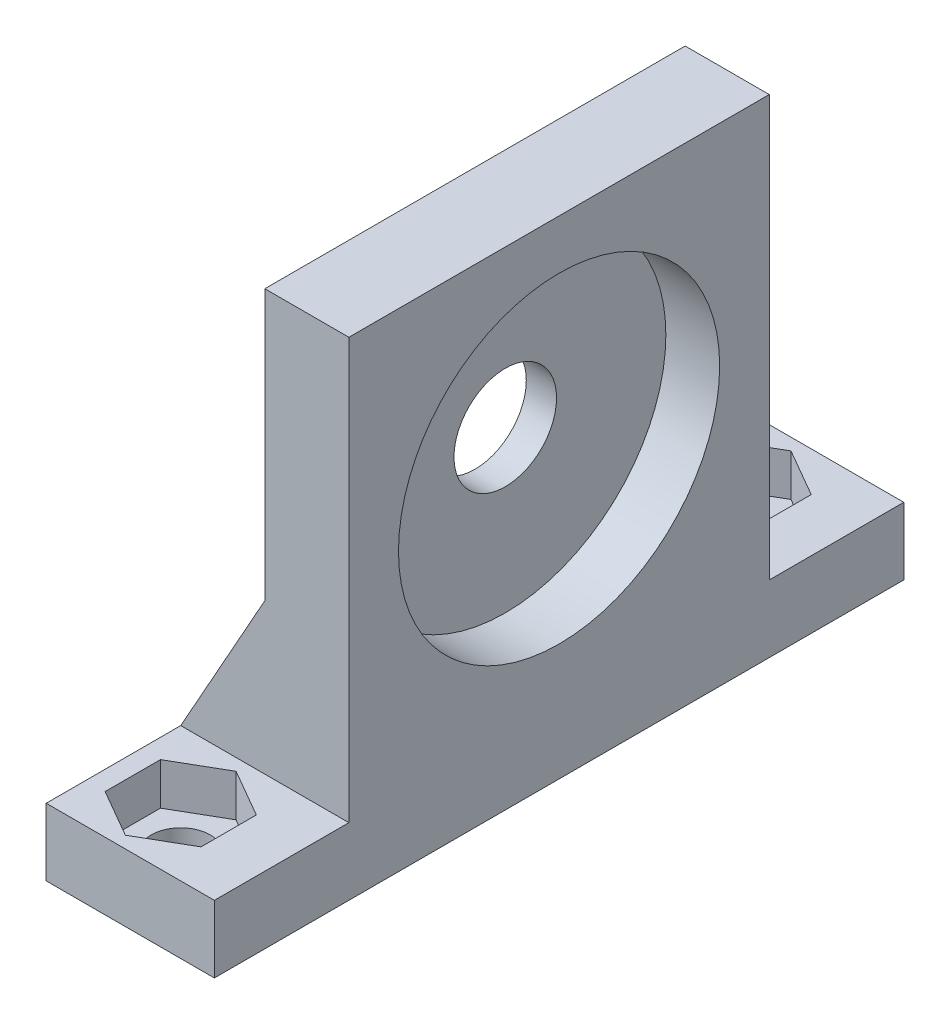
ISO-10303-21;
HEADER;
FILE_DESCRIPTION(('STEP AP214'),'2;1');
FILE_NAME('part.step','',(''),(''),'','','');
FILE_SCHEMA(('AUTOMOTIVE_DESIGN { 1 0 10303 214 1 1 1 1 }'));
ENDSEC;
DATA;
#1=APPLICATION_CONTEXT('core data for automotive mechanical design processes');
#2=APPLICATION_PROTOCOL_DEFINITION('international standard','automotive_design',2000,#1);
#3=PRODUCT_CONTEXT('',#1,'mechanical');
#4=PRODUCT('Part','Part','',(#3));
#5=PRODUCT_RELATED_PRODUCT_CATEGORY('part','',(#4));
#6=PRODUCT_DEFINITION_FORMATION('','',#4);
#7=PRODUCT_DEFINITION_CONTEXT('part definition',#1,'design');
#8=PRODUCT_DEFINITION('design','',#6,#7);
#9=PRODUCT_DEFINITION_SHAPE('','',#8);
#10=(LENGTH_UNIT() NAMED_UNIT(*) SI_UNIT(.MILLI.,.METRE.));
#11=(NAMED_UNIT(*) PLANE_ANGLE_UNIT() SI_UNIT($,.RADIAN.));
#12=(NAMED_UNIT(*) SI_UNIT($,.STERADIAN.) SOLID_ANGLE_UNIT());
#13=UNCERTAINTY_MEASURE_WITH_UNIT(LENGTH_MEASURE(1.E-05),#10,'distance_accuracy_value','');
#14=(GEOMETRIC_REPRESENTATION_CONTEXT(3) GLOBAL_UNCERTAINTY_ASSIGNED_CONTEXT((#13)) GLOBAL_UNIT_ASSIGNED_CONTEXT((#10,
#11,#12)) REPRESENTATION_CONTEXT('',''));
#15=CARTESIAN_POINT('',(0.,0.,0.));
#16=DIRECTION('',(0.,0.,1.));
#17=DIRECTION('',(1.,0.,0.));
#18=AXIS2_PLACEMENT_3D('',#15,#16,#17);
#19=CARTESIAN_POINT('',(5.,16.5,-12.5));
#20=DIRECTION('',(1.,0.,0.));
#21=DIRECTION('',(0.,0.,-1.));
#22=AXIS2_PLACEMENT_3D('',#19,#20,#21);
#23=CYLINDRICAL_SURFACE('',#22,3.05);
#24=CARTESIAN_POINT('',(5.,16.5,-12.5));
#25=DIRECTION('',(-1.,0.,0.));
#26=DIRECTION('',(0.,0.,1.));
#27=AXIS2_PLACEMENT_3D('',#24,#25,#26);
#28=CIRCLE('',#27,3.05);
#29=CARTESIAN_POINT('',(5.,16.5,-9.45));
#30=VERTEX_POINT('',#29);
#31=EDGE_CURVE('E514',#30,#30,#28,.T.);
#32=ORIENTED_EDGE('',*,*,#31,.T.);
#33=EDGE_LOOP('',(#32));
#34=FACE_BOUND('',#33,.T.);
#35=CARTESIAN_POINT('',(6.8,16.5,-12.5));
#36=DIRECTION('',(1.,0.,0.));
#37=DIRECTION('',(0.,0.,-1.));
#38=AXIS2_PLACEMENT_3D('',#35,#36,#37);
#39=CIRCLE('',#38,3.05);
#40=CARTESIAN_POINT('',(6.8,16.5,-15.55));
#41=VERTEX_POINT('',#40);
#42=EDGE_CURVE('E200',#41,#41,#39,.T.);
#43=ORIENTED_EDGE('',*,*,#42,.T.);
#44=EDGE_LOOP('',(#43));
#45=FACE_BOUND('',#44,.T.);
#46=ADVANCED_FACE('F196',(#34,#45),#23,.F.);
#47=CARTESIAN_POINT('',(0.,4.,0.));
#48=DIRECTION('',(0.,1.,0.));
#49=DIRECTION('',(0.,0.,1.));
#50=AXIS2_PLACEMENT_3D('',#47,#48,#49);
#51=PLANE('',#50);
#52=DIRECTION('',(0.866025403784439,0.,-0.5));
#53=VECTOR('',#52,1.);
#54=CARTESIAN_POINT('',(-12.9823683548744,4.,-22.4861215932168));
#55=LINE('',#54,#53);
#56=CARTESIAN_POINT('',(1.15000000000001,4.,-30.6454482671904));
#57=VERTEX_POINT('',#56);
#58=CARTESIAN_POINT('',(4.00000000000001,4.,-32.2908965343809));
#59=VERTEX_POINT('',#58);
#60=EDGE_CURVE('E549',#57,#59,#55,.T.);
#61=ORIENTED_EDGE('',*,*,#60,.T.);
#62=DIRECTION('',(0.866025403784438,0.,0.500000000000001));
#63=VECTOR('',#62,1.);
#64=CARTESIAN_POINT('',(14.9823683548744,4.,-25.9502232083545));
#65=LINE('',#64,#63);
#66=CARTESIAN_POINT('',(6.85,4.,-30.6454482671904));
#67=VERTEX_POINT('',#66);
#68=EDGE_CURVE('E543',#59,#67,#65,.T.);
#69=ORIENTED_EDGE('',*,*,#68,.T.);
#70=DIRECTION('',(0.,0.,1.));
#71=VECTOR('',#70,1.);
#72=CARTESIAN_POINT('',(6.84999999999999,4.,0.));
#73=LINE('',#72,#71);
#74=CARTESIAN_POINT('',(6.85,4.,-27.3545517328096));
#75=VERTEX_POINT('',#74);
#76=EDGE_CURVE('E568',#67,#75,#73,.T.);
#77=ORIENTED_EDGE('',*,*,#76,.T.);
#78=DIRECTION('',(-0.866025403784439,0.,0.5));
#79=VECTOR('',#78,1.);
#80=CARTESIAN_POINT('',(-10.1323683548744,4.,-17.5497767916455));
#81=LINE('',#80,#79);
#82=CARTESIAN_POINT('',(3.99999999999999,4.,-25.7091034656191));
#83=VERTEX_POINT('',#82);
#84=EDGE_CURVE('E572',#75,#83,#81,.T.);
#85=ORIENTED_EDGE('',*,*,#84,.T.);
#86=DIRECTION('',(-0.866025403784439,0.,-0.5));
#87=VECTOR('',#86,1.);
#88=CARTESIAN_POINT('',(12.1323683548744,4.,-21.0138784067832));
#89=LINE('',#88,#87);
#90=CARTESIAN_POINT('',(1.15,4.,-27.3545517328096));
#91=VERTEX_POINT('',#90);
#92=EDGE_CURVE('E576',#83,#91,#89,.T.);
#93=ORIENTED_EDGE('',*,*,#92,.T.);
#94=DIRECTION('',(0.,0.,-1.));
#95=VECTOR('',#94,1.);
#96=CARTESIAN_POINT('',(1.15,4.,0.));
#97=LINE('',#96,#95);
#98=EDGE_CURVE('E580',#91,#57,#97,.T.);
#99=ORIENTED_EDGE('',*,*,#98,.T.);
#100=EDGE_LOOP('',(#61,#69,#77,#85,#93,#99));
#101=FACE_BOUND('',#100,.T.);
#102=DIRECTION('',(1.,0.,0.));
#103=VECTOR('',#102,1.);
#104=CARTESIAN_POINT('',(0.,4.,-25.));
#105=LINE('',#104,#103);
#106=CARTESIAN_POINT('',(0.,4.,-25.));
#107=VERTEX_POINT('',#106);
#108=CARTESIAN_POINT('',(10.,4.,-25.));
#109=VERTEX_POINT('',#108);
#110=EDGE_CURVE('E381',#107,#109,#105,.T.);
#111=ORIENTED_EDGE('',*,*,#110,.T.);
#112=DIRECTION('',(0.,0.,-1.));
#113=VECTOR('',#112,1.);
#114=CARTESIAN_POINT('',(10.,4.,0.));
#115=LINE('',#114,#113);
#116=CARTESIAN_POINT('',(10.,4.,-33.));
#117=VERTEX_POINT('',#116);
#118=EDGE_CURVE('E498',#109,#117,#115,.T.);
#119=ORIENTED_EDGE('',*,*,#118,.T.);
#120=DIRECTION('',(1.,0.,0.));
#121=VECTOR('',#120,1.);
#122=CARTESIAN_POINT('',(0.,4.,-33.));
#123=LINE('',#122,#121);
#124=CARTESIAN_POINT('',(0.,4.,-33.));
#125=VERTEX_POINT('',#124);
#126=EDGE_CURVE('E382',#125,#117,#123,.T.);
#127=ORIENTED_EDGE('',*,*,#126,.F.);
#128=DIRECTION('',(0.,0.,-1.));
#129=VECTOR('',#128,1.);
#130=CARTESIAN_POINT('',(0.,4.,0.));
#131=LINE('',#130,#129);
#132=EDGE_CURVE('E409',#107,#125,#131,.T.);
#133=ORIENTED_EDGE('',*,*,#132,.F.);
#134=EDGE_LOOP('',(#111,#119,#127,#133));
#135=FACE_BOUND('',#134,.T.);
#136=ADVANCED_FACE('F497',(#101,#135),#51,.T.);
#137=DIRECTION('',(-0.866025403784439,0.,-0.5));
#138=VECTOR('',#137,1.);
#139=CARTESIAN_POINT('',(0.692949192431123,4.,-1.20022320835453));
#140=LINE('',#139,#138);
#141=CARTESIAN_POINT('',(6.85,4.,2.35455173280957));
#142=VERTEX_POINT('',#141);
#143=CARTESIAN_POINT('',(4.,4.,0.709103465619132));
#144=VERTEX_POINT('',#143);
#145=EDGE_CURVE('E610',#142,#144,#140,.T.);
#146=ORIENTED_EDGE('',*,*,#145,.F.);
#147=DIRECTION('',(0.,0.,-1.));
#148=VECTOR('',#147,1.);
#149=CARTESIAN_POINT('',(6.85,4.,0.));
#150=LINE('',#149,#148);
#151=CARTESIAN_POINT('',(6.85,4.,5.64544826719043));
#152=VERTEX_POINT('',#151);
#153=EDGE_CURVE('E616',#152,#142,#150,.T.);
#154=ORIENTED_EDGE('',*,*,#153,.F.);
#155=DIRECTION('',(0.866025403784437,0.,-0.500000000000002));
#156=VECTOR('',#155,1.);
#157=CARTESIAN_POINT('',(4.1570508075689,4.,7.20022320835452));
#158=LINE('',#157,#156);
#159=CARTESIAN_POINT('',(4.00000000000001,4.,7.29089653438087));
#160=VERTEX_POINT('',#159);
#161=EDGE_CURVE('E651',#160,#152,#158,.T.);
#162=ORIENTED_EDGE('',*,*,#161,.F.);
#163=DIRECTION('',(0.866025403784439,0.,0.5));
#164=VECTOR('',#163,1.);
#165=CARTESIAN_POINT('',(-2.15705080756887,4.,3.73612159321677));
#166=LINE('',#165,#164);
#167=CARTESIAN_POINT('',(1.15,4.,5.64544826719043));
#168=VERTEX_POINT('',#167);
#169=EDGE_CURVE('E647',#168,#160,#166,.T.);
#170=ORIENTED_EDGE('',*,*,#169,.F.);
#171=DIRECTION('',(0.,0.,1.));
#172=VECTOR('',#171,1.);
#173=CARTESIAN_POINT('',(1.15,4.,0.));
#174=LINE('',#173,#172);
#175=CARTESIAN_POINT('',(1.15,4.,2.35455173280956));
#176=VERTEX_POINT('',#175);
#177=EDGE_CURVE('E643',#176,#168,#174,.T.);
#178=ORIENTED_EDGE('',*,*,#177,.F.);
#179=DIRECTION('',(-0.866025403784439,0.,0.5));
#180=VECTOR('',#179,1.);
#181=CARTESIAN_POINT('',(1.30705080756888,4.,2.26387840678323));
#182=LINE('',#181,#180);
#183=EDGE_CURVE('E639',#144,#176,#182,.T.);
#184=ORIENTED_EDGE('',*,*,#183,.F.);
#185=EDGE_LOOP('',(#146,#154,#162,#170,#178,#184));
#186=FACE_BOUND('',#185,.T.);
#187=DIRECTION('',(1.,0.,0.));
#188=VECTOR('',#187,1.);
#189=CARTESIAN_POINT('',(0.,4.,8.));
#190=LINE('',#189,#188);
#191=CARTESIAN_POINT('',(0.,4.,8.));
#192=VERTEX_POINT('',#191);
#193=CARTESIAN_POINT('',(10.,4.,8.));
#194=VERTEX_POINT('',#193);
#195=EDGE_CURVE('E374',#192,#194,#190,.T.);
#196=ORIENTED_EDGE('',*,*,#195,.T.);
#197=DIRECTION('',(0.,0.,-1.));
#198=VECTOR('',#197,1.);
#199=CARTESIAN_POINT('',(10.,4.,0.));
#200=LINE('',#199,#198);
#201=CARTESIAN_POINT('',(10.,4.,0.));
#202=VERTEX_POINT('',#201);
#203=EDGE_CURVE('E361',#194,#202,#200,.T.);
#204=ORIENTED_EDGE('',*,*,#203,.T.);
#205=DIRECTION('',(-1.,0.,0.));
#206=VECTOR('',#205,1.);
#207=CARTESIAN_POINT('',(0.,4.,0.));
#208=LINE('',#207,#206);
#209=CARTESIAN_POINT('',(0.,4.,0.));
#210=VERTEX_POINT('',#209);
#211=EDGE_CURVE('E372',#202,#210,#208,.T.);
#212=ORIENTED_EDGE('',*,*,#211,.T.);
#213=EDGE_CURVE('E477',#192,#210,#131,.T.);
#214=ORIENTED_EDGE('',*,*,#213,.F.);
#215=EDGE_LOOP('',(#196,#204,#212,#214));
#216=FACE_BOUND('',#215,.T.);
#217=ADVANCED_FACE('F370',(#186,#216),#51,.T.);
#218=CARTESIAN_POINT('',(0.,4.,8.));
#219=DIRECTION('',(0.,0.,-1.));
#220=DIRECTION('',(-1.,0.,0.));
#221=AXIS2_PLACEMENT_3D('',#218,#219,#220);
#222=PLANE('',#221);
#223=DIRECTION('',(0.,-1.,0.));
#224=VECTOR('',#223,1.);
#225=CARTESIAN_POINT('',(10.,4.,8.));
#226=LINE('',#225,#224);
#227=CARTESIAN_POINT('',(10.,0.,8.));
#228=VERTEX_POINT('',#227);
#229=EDGE_CURVE('E503',#194,#228,#226,.T.);
#230=ORIENTED_EDGE('',*,*,#229,.F.);
#231=ORIENTED_EDGE('',*,*,#195,.F.);
#232=DIRECTION('',(0.,-1.,0.));
#233=VECTOR('',#232,1.);
#234=CARTESIAN_POINT('',(0.,4.,8.));
#235=LINE('',#234,#233);
#236=CARTESIAN_POINT('',(0.,0.,8.));
#237=VERTEX_POINT('',#236);
#238=EDGE_CURVE('E413',#192,#237,#235,.T.);
#239=ORIENTED_EDGE('',*,*,#238,.T.);
#240=DIRECTION('',(1.,0.,0.));
#241=VECTOR('',#240,1.);
#242=CARTESIAN_POINT('',(0.,0.,8.));
#243=LINE('',#242,#241);
#244=EDGE_CURVE('E396',#237,#228,#243,.T.);
#245=ORIENTED_EDGE('',*,*,#244,.T.);
#246=EDGE_LOOP('',(#230,#231,#239,#245));
#247=FACE_BOUND('',#246,.T.);
#248=ADVANCED_FACE('F797',(#247),#222,.F.);
#249=CARTESIAN_POINT('',(0.,4.,-33.));
#250=DIRECTION('',(0.,0.,-1.));
#251=DIRECTION('',(-1.,0.,0.));
#252=AXIS2_PLACEMENT_3D('',#249,#250,#251);
#253=PLANE('',#252);
#254=ORIENTED_EDGE('',*,*,#126,.T.);
#255=DIRECTION('',(0.,-1.,0.));
#256=VECTOR('',#255,1.);
#257=CARTESIAN_POINT('',(10.,4.,-33.));
#258=LINE('',#257,#256);
#259=CARTESIAN_POINT('',(10.,0.,-33.));
#260=VERTEX_POINT('',#259);
#261=EDGE_CURVE('E507',#117,#260,#258,.T.);
#262=ORIENTED_EDGE('',*,*,#261,.T.);
#263=DIRECTION('',(1.,0.,0.));
#264=VECTOR('',#263,1.);
#265=CARTESIAN_POINT('',(0.,0.,-33.));
#266=LINE('',#265,#264);
#267=CARTESIAN_POINT('',(0.,0.,-33.));
#268=VERTEX_POINT('',#267);
#269=EDGE_CURVE('E401',#268,#260,#266,.T.);
#270=ORIENTED_EDGE('',*,*,#269,.F.);
#271=DIRECTION('',(0.,-1.,0.));
#272=VECTOR('',#271,1.);
#273=CARTESIAN_POINT('',(0.,4.,-33.));
#274=LINE('',#273,#272);
#275=EDGE_CURVE('E387',#125,#268,#274,.T.);
#276=ORIENTED_EDGE('',*,*,#275,.F.);
#277=EDGE_LOOP('',(#254,#262,#270,#276));
#278=FACE_BOUND('',#277,.T.);
#279=ADVANCED_FACE('F494',(#278),#253,.T.);
#280=CARTESIAN_POINT('',(0.,0.,0.));
#281=DIRECTION('',(0.,1.,0.));
#282=DIRECTION('',(0.,0.,1.));
#283=AXIS2_PLACEMENT_3D('',#280,#281,#282);
#284=PLANE('',#283);
#285=CARTESIAN_POINT('',(4.,0.,4.));
#286=DIRECTION('',(0.,1.,0.));
#287=DIRECTION('',(0.,0.,1.));
#288=AXIS2_PLACEMENT_3D('',#285,#286,#287);
#289=CIRCLE('',#288,1.75);
#290=CARTESIAN_POINT('',(4.,0.,5.75));
#291=VERTEX_POINT('',#290);
#292=EDGE_CURVE('E397',#291,#291,#289,.T.);
#293=ORIENTED_EDGE('',*,*,#292,.T.);
#294=EDGE_LOOP('',(#293));
#295=FACE_BOUND('',#294,.T.);
#296=CARTESIAN_POINT('',(4.,0.,-29.));
#297=DIRECTION('',(0.,1.,0.));
#298=DIRECTION('',(0.,0.,1.));
#299=AXIS2_PLACEMENT_3D('',#296,#297,#298);
#300=CIRCLE('',#299,1.74999999999999);
#301=CARTESIAN_POINT('',(4.,0.,-27.25));
#302=VERTEX_POINT('',#301);
#303=EDGE_CURVE('E405',#302,#302,#300,.F.);
#304=ORIENTED_EDGE('',*,*,#303,.F.);
#305=EDGE_LOOP('',(#304));
#306=FACE_BOUND('',#305,.T.);
#307=DIRECTION('',(0.,0.,-1.));
#308=VECTOR('',#307,1.);
#309=CARTESIAN_POINT('',(10.,0.,0.));
#310=LINE('',#309,#308);
#311=EDGE_CURVE('E502',#228,#260,#310,.T.);
#312=ORIENTED_EDGE('',*,*,#311,.F.);
#313=ORIENTED_EDGE('',*,*,#244,.F.);
#314=DIRECTION('',(0.,0.,-1.));
#315=VECTOR('',#314,1.);
#316=CARTESIAN_POINT('',(0.,0.,0.));
#317=LINE('',#316,#315);
#318=EDGE_CURVE('E393',#237,#268,#317,.T.);
#319=ORIENTED_EDGE('',*,*,#318,.T.);
#320=ORIENTED_EDGE('',*,*,#269,.T.);
#321=EDGE_LOOP('',(#312,#313,#319,#320));
#322=FACE_BOUND('',#321,.T.);
#323=ADVANCED_FACE('F782',(#295,#306,#322),#284,.F.);
#324=CARTESIAN_POINT('',(0.,29.,0.));
#325=DIRECTION('',(0.,1.,0.));
#326=DIRECTION('',(0.,0.,1.));
#327=AXIS2_PLACEMENT_3D('',#324,#325,#326);
#328=PLANE('',#327);
#329=DIRECTION('',(-1.,0.,0.));
#330=VECTOR('',#329,1.);
#331=CARTESIAN_POINT('',(0.,29.,0.));
#332=LINE('',#331,#330);
#333=CARTESIAN_POINT('',(10.,29.,0.));
#334=VERTEX_POINT('',#333);
#335=CARTESIAN_POINT('',(5.,29.,0.));
#336=VERTEX_POINT('',#335);
#337=EDGE_CURVE('E471',#334,#336,#332,.T.);
#338=ORIENTED_EDGE('',*,*,#337,.F.);
#339=DIRECTION('',(0.,0.,-1.));
#340=VECTOR('',#339,1.);
#341=CARTESIAN_POINT('',(10.,29.,0.));
#342=LINE('',#341,#340);
#343=CARTESIAN_POINT('',(10.,29.,-25.));
#344=VERTEX_POINT('',#343);
#345=EDGE_CURVE('E213',#334,#344,#342,.T.);
#346=ORIENTED_EDGE('',*,*,#345,.T.);
#347=DIRECTION('',(1.,0.,0.));
#348=VECTOR('',#347,1.);
#349=CARTESIAN_POINT('',(0.,29.,-25.));
#350=LINE('',#349,#348);
#351=CARTESIAN_POINT('',(5.,29.,-25.));
#352=VERTEX_POINT('',#351);
#353=EDGE_CURVE('E419',#352,#344,#350,.T.);
#354=ORIENTED_EDGE('',*,*,#353,.F.);
#355=DIRECTION('',(0.,0.,-1.));
#356=VECTOR('',#355,1.);
#357=CARTESIAN_POINT('',(5.,29.,0.));
#358=LINE('',#357,#356);
#359=EDGE_CURVE('E522',#336,#352,#358,.T.);
#360=ORIENTED_EDGE('',*,*,#359,.F.);
#361=EDGE_LOOP('',(#338,#346,#354,#360));
#362=FACE_BOUND('',#361,.T.);
#363=ADVANCED_FACE('F779',(#362),#328,.T.);
#364=CARTESIAN_POINT('',(0.,29.,-25.));
#365=DIRECTION('',(0.,0.,-1.));
#366=DIRECTION('',(-1.,0.,0.));
#367=AXIS2_PLACEMENT_3D('',#364,#365,#366);
#368=PLANE('',#367);
#369=ORIENTED_EDGE('',*,*,#353,.T.);
#370=DIRECTION('',(0.,-1.,0.));
#371=VECTOR('',#370,1.);
#372=CARTESIAN_POINT('',(10.,29.,-25.));
#373=LINE('',#372,#371);
#374=EDGE_CURVE('E376',#344,#109,#373,.T.);
#375=ORIENTED_EDGE('',*,*,#374,.T.);
#376=ORIENTED_EDGE('',*,*,#110,.F.);
#377=DIRECTION('',(-0.488603368931843,-0.87250601594972,0.));
#378=VECTOR('',#377,1.);
#379=CARTESIAN_POINT('',(7.,16.5,-25.));
#380=LINE('',#379,#378);
#381=CARTESIAN_POINT('',(5.,12.9285714285714,-25.));
#382=VERTEX_POINT('',#381);
#383=EDGE_CURVE('E445',#382,#107,#380,.T.);
#384=ORIENTED_EDGE('',*,*,#383,.F.);
#385=DIRECTION('',(0.,-1.,0.));
#386=VECTOR('',#385,1.);
#387=CARTESIAN_POINT('',(5.,29.,-25.));
#388=LINE('',#387,#386);
#389=EDGE_CURVE('E526',#352,#382,#388,.T.);
#390=ORIENTED_EDGE('',*,*,#389,.F.);
#391=EDGE_LOOP('',(#369,#375,#376,#384,#390));
#392=FACE_BOUND('',#391,.T.);
#393=ADVANCED_FACE('F781',(#392),#368,.T.);
#394=CARTESIAN_POINT('',(0.,29.,0.));
#395=DIRECTION('',(0.,0.,1.));
#396=DIRECTION('',(1.,0.,0.));
#397=AXIS2_PLACEMENT_3D('',#394,#395,#396);
#398=PLANE('',#397);
#399=ORIENTED_EDGE('',*,*,#211,.F.);
#400=DIRECTION('',(0.,1.,0.));
#401=VECTOR('',#400,1.);
#402=CARTESIAN_POINT('',(10.,29.,0.));
#403=LINE('',#402,#401);
#404=EDGE_CURVE('E357',#202,#334,#403,.T.);
#405=ORIENTED_EDGE('',*,*,#404,.T.);
#406=ORIENTED_EDGE('',*,*,#337,.T.);
#407=DIRECTION('',(0.,1.,0.));
#408=VECTOR('',#407,1.);
#409=CARTESIAN_POINT('',(5.,29.,0.));
#410=LINE('',#409,#408);
#411=CARTESIAN_POINT('',(5.,12.9285714285714,0.));
#412=VERTEX_POINT('',#411);
#413=EDGE_CURVE('E518',#412,#336,#410,.T.);
#414=ORIENTED_EDGE('',*,*,#413,.F.);
#415=DIRECTION('',(-0.488603368931843,-0.87250601594972,0.));
#416=VECTOR('',#415,1.);
#417=CARTESIAN_POINT('',(7.,16.5,0.));
#418=LINE('',#417,#416);
#419=EDGE_CURVE('E221',#412,#210,#418,.T.);
#420=ORIENTED_EDGE('',*,*,#419,.T.);
#421=EDGE_LOOP('',(#399,#405,#406,#414,#420));
#422=FACE_BOUND('',#421,.T.);
#423=ADVANCED_FACE('F378',(#422),#398,.T.);
#424=CARTESIAN_POINT('',(-16.,16.5,-12.5));
#425=DIRECTION('',(1.,0.,0.));
#426=DIRECTION('',(0.,0.,-1.));
#427=AXIS2_PLACEMENT_3D('',#424,#425,#426);
#428=CYLINDRICAL_SURFACE('',#427,9.55);
#429=CARTESIAN_POINT('',(10.,16.5,-12.5));
#430=DIRECTION('',(1.,0.,0.));
#431=DIRECTION('',(0.,0.,-1.));
#432=AXIS2_PLACEMENT_3D('',#429,#430,#431);
#433=CIRCLE('',#432,9.55);
#434=CARTESIAN_POINT('',(9.99999999999999,16.5,-22.05));
#435=VERTEX_POINT('',#434);
#436=EDGE_CURVE('E13',#435,#435,#433,.F.);
#437=CARTESIAN_POINT('',(6.8,16.5,-12.5));
#438=DIRECTION('',(1.,0.,0.));
#439=DIRECTION('',(0.,0.,-1.));
#440=AXIS2_PLACEMENT_3D('',#437,#438,#439);
#441=CIRCLE('',#440,9.55);
#442=CARTESIAN_POINT('',(6.8,16.5,-22.05));
#443=VERTEX_POINT('',#442);
#444=EDGE_CURVE('E910',#443,#443,#441,.T.);
#445=CARTESIAN_POINT('',(9.99999999999999,16.5,-22.05));
#446=CARTESIAN_POINT('',(9.96666666666666,16.5,-22.05));
#447=CARTESIAN_POINT('',(9.93333333333333,16.5,-22.05));
#448=CARTESIAN_POINT('',(9.86666666666666,16.5,-22.05));
#449=CARTESIAN_POINT('',(9.83333333333333,16.5,-22.05));
#450=CARTESIAN_POINT('',(9.76666666666666,16.5,-22.05));
#451=CARTESIAN_POINT('',(9.73333333333333,16.5,-22.05));
#452=CARTESIAN_POINT('',(9.66666666666666,16.5,-22.05));
#453=CARTESIAN_POINT('',(9.63333333333333,16.5,-22.05));
#454=CARTESIAN_POINT('',(9.56666666666666,16.5,-22.05));
#455=CARTESIAN_POINT('',(9.53333333333333,16.5,-22.05));
#456=CARTESIAN_POINT('',(9.46666666666666,16.5,-22.05));
#457=CARTESIAN_POINT('',(9.43333333333333,16.5,-22.05));
#458=CARTESIAN_POINT('',(9.36666666666666,16.5,-22.05));
#459=CARTESIAN_POINT('',(9.33333333333333,16.5,-22.05));
#460=CARTESIAN_POINT('',(9.26666666666666,16.5,-22.05));
#461=CARTESIAN_POINT('',(9.23333333333333,16.5,-22.05));
#462=CARTESIAN_POINT('',(9.16666666666666,16.5,-22.05));
#463=CARTESIAN_POINT('',(9.13333333333333,16.5,-22.05));
#464=CARTESIAN_POINT('',(9.06666666666666,16.5,-22.05));
#465=CARTESIAN_POINT('',(9.03333333333333,16.5,-22.05));
#466=CARTESIAN_POINT('',(8.96666666666667,16.5,-22.05));
#467=CARTESIAN_POINT('',(8.93333333333333,16.5,-22.05));
#468=CARTESIAN_POINT('',(8.86666666666666,16.5,-22.05));
#469=CARTESIAN_POINT('',(8.83333333333333,16.5,-22.05));
#470=CARTESIAN_POINT('',(8.76666666666666,16.5,-22.05));
#471=CARTESIAN_POINT('',(8.73333333333333,16.5,-22.05));
#472=CARTESIAN_POINT('',(8.66666666666666,16.5,-22.05));
#473=CARTESIAN_POINT('',(8.63333333333333,16.5,-22.05));
#474=CARTESIAN_POINT('',(8.56666666666666,16.5,-22.05));
#475=CARTESIAN_POINT('',(8.53333333333333,16.5,-22.05));
#476=CARTESIAN_POINT('',(8.46666666666666,16.5,-22.05));
#477=CARTESIAN_POINT('',(8.43333333333333,16.5,-22.05));
#478=CARTESIAN_POINT('',(8.36666666666667,16.5,-22.05));
#479=CARTESIAN_POINT('',(8.33333333333333,16.5,-22.05));
#480=CARTESIAN_POINT('',(8.26666666666667,16.5,-22.05));
#481=CARTESIAN_POINT('',(8.23333333333333,16.5,-22.05));
#482=CARTESIAN_POINT('',(8.16666666666667,16.5,-22.05));
#483=CARTESIAN_POINT('',(8.13333333333333,16.5,-22.05));
#484=CARTESIAN_POINT('',(8.06666666666667,16.5,-22.05));
#485=CARTESIAN_POINT('',(8.03333333333333,16.5,-22.05));
#486=CARTESIAN_POINT('',(7.96666666666667,16.5,-22.05));
#487=CARTESIAN_POINT('',(7.93333333333333,16.5,-22.05));
#488=CARTESIAN_POINT('',(7.86666666666666,16.5,-22.05));
#489=CARTESIAN_POINT('',(7.83333333333333,16.5,-22.05));
#490=CARTESIAN_POINT('',(7.76666666666666,16.5,-22.05));
#491=CARTESIAN_POINT('',(7.73333333333333,16.5,-22.05));
#492=CARTESIAN_POINT('',(7.66666666666667,16.5,-22.05));
#493=CARTESIAN_POINT('',(7.63333333333333,16.5,-22.05));
#494=CARTESIAN_POINT('',(7.56666666666667,16.5,-22.05));
#495=CARTESIAN_POINT('',(7.53333333333333,16.5,-22.05));
#496=CARTESIAN_POINT('',(7.46666666666667,16.5,-22.05));
#497=CARTESIAN_POINT('',(7.43333333333333,16.5,-22.05));
#498=CARTESIAN_POINT('',(7.36666666666667,16.5,-22.05));
#499=CARTESIAN_POINT('',(7.33333333333333,16.5,-22.05));
#500=CARTESIAN_POINT('',(7.26666666666667,16.5,-22.05));
#501=CARTESIAN_POINT('',(7.23333333333333,16.5,-22.05));
#502=CARTESIAN_POINT('',(7.16666666666667,16.5,-22.05));
#503=CARTESIAN_POINT('',(7.13333333333333,16.5,-22.05));
#504=CARTESIAN_POINT('',(7.06666666666667,16.5,-22.05));
#505=CARTESIAN_POINT('',(7.03333333333333,16.5,-22.05));
#506=CARTESIAN_POINT('',(6.96666666666667,16.5,-22.05));
#507=CARTESIAN_POINT('',(6.93333333333333,16.5,-22.05));
#508=CARTESIAN_POINT('',(6.86666666666667,16.5,-22.05));
#509=CARTESIAN_POINT('',(6.83333333333333,16.5,-22.05));
#510=CARTESIAN_POINT('',(6.8,16.5,-22.05));
#511=B_SPLINE_CURVE_WITH_KNOTS('',3,(#445,#446,#447,#448,#449,#450,#451,#452,#453,#454,#455,
#456,#457,#458,#459,#460,#461,#462,#463,#464,#465,#466,#467,#468,#469,#470,#471,#472,#473,#474,
#475,#476,#477,#478,#479,#480,#481,#482,#483,#484,#485,#486,#487,#488,#489,#490,#491,#492,#493,
#494,#495,#496,#497,#498,#499,#500,#501,#502,#503,#504,#505,#506,#507,#508,#509,#510),
.UNSPECIFIED.,.F.,.F.,(4,2,2,2,2,2,2,2,2,2,2,2,2,2,2,2,2,2,2,2,2,2,2,2,2,2,2,2,2,2,2,2,4),(0.,
0.0999999999999994,0.199999999999999,0.299999999999998,0.399999999999998,0.5,0.6,
0.699999999999999,0.799999999999999,0.899999999999998,0.999999999999997,1.1,1.2,1.3,1.4,1.5,1.6,
1.7,1.8,1.9,1.99999999999999,2.1,2.2,2.3,2.4,2.5,2.59999999999999,2.69999999999999,2.8,2.9,3.,
3.1,3.19999999999999),.UNSPECIFIED.);
#512=EDGE_CURVE('BSEAM775',#435,#443,#511,.T.);
#513=ORIENTED_EDGE('',*,*,#436,.F.);
#514=ORIENTED_EDGE('',*,*,#444,.F.);
#515=ORIENTED_EDGE('',*,*,#512,.T.);
#516=ORIENTED_EDGE('',*,*,#512,.F.);
#517=EDGE_LOOP('',(#513,#515,#514,#516));
#518=FACE_BOUND('',#517,.T.);
#519=ADVANCED_FACE('F775',(#518),#428,.F.);
#520=DIRECTION('',(1.,0.,0.));
#521=VECTOR('',#520,1.);
#522=CARTESIAN_POINT('',(0.,4.,-2.95));
#523=LINE('',#522,#521);
#524=CARTESIAN_POINT('',(0.,4.,-2.95));
#525=VERTEX_POINT('',#524);
#526=CARTESIAN_POINT('',(5.,4.,-2.95));
#527=VERTEX_POINT('',#526);
#528=EDGE_CURVE('E462',#525,#527,#523,.T.);
#529=ORIENTED_EDGE('',*,*,#528,.T.);
#530=DIRECTION('',(0.,0.,1.));
#531=VECTOR('',#530,1.);
#532=CARTESIAN_POINT('',(5.,4.,0.));
#533=LINE('',#532,#531);
#534=CARTESIAN_POINT('',(5.,4.,-22.05));
#535=VERTEX_POINT('',#534);
#536=EDGE_CURVE('E429',#535,#527,#533,.T.);
#537=ORIENTED_EDGE('',*,*,#536,.F.);
#538=DIRECTION('',(-1.,0.,0.));
#539=VECTOR('',#538,1.);
#540=CARTESIAN_POINT('',(0.,4.,-22.05));
#541=LINE('',#540,#539);
#542=CARTESIAN_POINT('',(0.,4.,-22.05));
#543=VERTEX_POINT('',#542);
#544=EDGE_CURVE('E437',#535,#543,#541,.T.);
#545=ORIENTED_EDGE('',*,*,#544,.T.);
#546=EDGE_CURVE('E480',#525,#543,#131,.T.);
#547=ORIENTED_EDGE('',*,*,#546,.F.);
#548=EDGE_LOOP('',(#529,#537,#545,#547));
#549=FACE_BOUND('',#548,.T.);
#550=ADVANCED_FACE('F715',(#549),#51,.T.);
#551=CARTESIAN_POINT('',(7.,16.5,0.));
#552=DIRECTION('',(-0.87250601594972,0.488603368931843,0.));
#553=DIRECTION('',(-0.488603368931843,-0.87250601594972,0.));
#554=AXIS2_PLACEMENT_3D('',#551,#552,#553);
#555=PLANE('',#554);
#556=ORIENTED_EDGE('',*,*,#419,.F.);
#557=DIRECTION('',(0.,0.,-1.));
#558=VECTOR('',#557,1.);
#559=CARTESIAN_POINT('',(5.,12.9285714285714,0.));
#560=LINE('',#559,#558);
#561=CARTESIAN_POINT('',(5.,12.9285714285714,-2.95));
#562=VERTEX_POINT('',#561);
#563=EDGE_CURVE('E536',#412,#562,#560,.T.);
#564=ORIENTED_EDGE('',*,*,#563,.T.);
#565=DIRECTION('',(-0.488603368931843,-0.87250601594972,0.));
#566=VECTOR('',#565,1.);
#567=CARTESIAN_POINT('',(7.,16.5,-2.95));
#568=LINE('',#567,#566);
#569=EDGE_CURVE('E459',#562,#525,#568,.T.);
#570=ORIENTED_EDGE('',*,*,#569,.T.);
#571=DIRECTION('',(0.,0.,1.));
#572=VECTOR('',#571,1.);
#573=CARTESIAN_POINT('',(0.,4.,0.));
#574=LINE('',#573,#572);
#575=EDGE_CURVE('E468',#525,#210,#574,.T.);
#576=ORIENTED_EDGE('',*,*,#575,.T.);
#577=EDGE_LOOP('',(#556,#564,#570,#576));
#578=FACE_BOUND('',#577,.T.);
#579=ADVANCED_FACE('F771',(#578),#555,.T.);
#580=CARTESIAN_POINT('',(10.,14.5,-2.95));
#581=DIRECTION('',(0.,0.,1.));
#582=DIRECTION('',(1.,0.,0.));
#583=AXIS2_PLACEMENT_3D('',#580,#581,#582);
#584=PLANE('',#583);
#585=DIRECTION('',(0.,1.,0.));
#586=VECTOR('',#585,1.);
#587=CARTESIAN_POINT('',(5.,14.5,-2.95));
#588=LINE('',#587,#586);
#589=EDGE_CURVE('E533',#527,#562,#588,.T.);
#590=ORIENTED_EDGE('',*,*,#589,.F.);
#591=ORIENTED_EDGE('',*,*,#528,.F.);
#592=ORIENTED_EDGE('',*,*,#569,.F.);
#593=EDGE_LOOP('',(#590,#591,#592));
#594=FACE_BOUND('',#593,.T.);
#595=ADVANCED_FACE('F768',(#594),#584,.F.);
#596=CARTESIAN_POINT('',(7.,16.5,-25.));
#597=DIRECTION('',(0.87250601594972,-0.488603368931843,0.));
#598=DIRECTION('',(-0.488603368931843,-0.87250601594972,0.));
#599=AXIS2_PLACEMENT_3D('',#596,#597,#598);
#600=PLANE('',#599);
#601=DIRECTION('',(-0.488603368931843,-0.87250601594972,0.));
#602=VECTOR('',#601,1.);
#603=CARTESIAN_POINT('',(7.,16.5,-22.05));
#604=LINE('',#603,#602);
#605=CARTESIAN_POINT('',(5.,12.9285714285714,-22.05));
#606=VERTEX_POINT('',#605);
#607=EDGE_CURVE('E435',#606,#543,#604,.T.);
#608=ORIENTED_EDGE('',*,*,#607,.F.);
#609=DIRECTION('',(0.,0.,1.));
#610=VECTOR('',#609,1.);
#611=CARTESIAN_POINT('',(5.,12.9285714285714,-25.));
#612=LINE('',#611,#610);
#613=EDGE_CURVE('E431',#606,#382,#612,.F.);
#614=ORIENTED_EDGE('',*,*,#613,.T.);
#615=ORIENTED_EDGE('',*,*,#383,.T.);
#616=DIRECTION('',(0.,0.,1.));
#617=VECTOR('',#616,1.);
#618=CARTESIAN_POINT('',(0.,3.99999999999999,0.));
#619=LINE('',#618,#617);
#620=EDGE_CURVE('E443',#543,#107,#619,.F.);
#621=ORIENTED_EDGE('',*,*,#620,.F.);
#622=EDGE_LOOP('',(#608,#614,#615,#621));
#623=FACE_BOUND('',#622,.T.);
#624=ADVANCED_FACE('F440',(#623),#600,.F.);
#625=CARTESIAN_POINT('',(10.,14.5,-22.05));
#626=DIRECTION('',(0.,0.,-1.));
#627=DIRECTION('',(-1.,0.,0.));
#628=AXIS2_PLACEMENT_3D('',#625,#626,#627);
#629=PLANE('',#628);
#630=DIRECTION('',(0.,-1.,0.));
#631=VECTOR('',#630,1.);
#632=CARTESIAN_POINT('',(5.,14.5,-22.05));
#633=LINE('',#632,#631);
#634=EDGE_CURVE('E206',#606,#535,#633,.T.);
#635=ORIENTED_EDGE('',*,*,#634,.F.);
#636=ORIENTED_EDGE('',*,*,#607,.T.);
#637=ORIENTED_EDGE('',*,*,#544,.F.);
#638=EDGE_LOOP('',(#635,#636,#637));
#639=FACE_BOUND('',#638,.T.);
#640=ADVANCED_FACE('F434',(#639),#629,.F.);
#641=CARTESIAN_POINT('',(4.,4.,4.));
#642=DIRECTION('',(0.,-1.,0.));
#643=DIRECTION('',(0.,0.,-1.));
#644=AXIS2_PLACEMENT_3D('',#641,#642,#643);
#645=CYLINDRICAL_SURFACE('',#644,1.75);
#646=ORIENTED_EDGE('',*,*,#292,.F.);
#647=EDGE_LOOP('',(#646));
#648=FACE_BOUND('',#647,.T.);
#649=CARTESIAN_POINT('',(4.,1.5,4.));
#650=DIRECTION('',(0.,1.,0.));
#651=DIRECTION('',(0.,0.,1.));
#652=AXIS2_PLACEMENT_3D('',#649,#650,#651);
#653=CIRCLE('',#652,1.75);
#654=CARTESIAN_POINT('',(4.,1.5,5.75));
#655=VERTEX_POINT('',#654);
#656=EDGE_CURVE('E606',#655,#655,#653,.T.);
#657=ORIENTED_EDGE('',*,*,#656,.T.);
#658=EDGE_LOOP('',(#657));
#659=FACE_BOUND('',#658,.T.);
#660=ADVANCED_FACE('F198',(#648,#659),#645,.F.);
#661=CARTESIAN_POINT('',(4.,4.,-29.));
#662=DIRECTION('',(0.,-1.,0.));
#663=DIRECTION('',(0.,0.,-1.));
#664=AXIS2_PLACEMENT_3D('',#661,#662,#663);
#665=CYLINDRICAL_SURFACE('',#664,1.74999999999999);
#666=CARTESIAN_POINT('',(4.,1.5,-29.));
#667=DIRECTION('',(0.,1.,0.));
#668=DIRECTION('',(0.,0.,1.));
#669=AXIS2_PLACEMENT_3D('',#666,#667,#668);
#670=CIRCLE('',#669,1.74999999999999);
#671=CARTESIAN_POINT('',(4.,1.5,-27.25));
#672=VERTEX_POINT('',#671);
#673=EDGE_CURVE('E539',#672,#672,#670,.T.);
#674=ORIENTED_EDGE('',*,*,#673,.T.);
#675=EDGE_LOOP('',(#674));
#676=FACE_BOUND('',#675,.T.);
#677=ORIENTED_EDGE('',*,*,#303,.T.);
#678=EDGE_LOOP('',(#677));
#679=FACE_BOUND('',#678,.T.);
#680=ADVANCED_FACE('F761',(#676,#679),#665,.F.);
#681=CARTESIAN_POINT('',(0.,4.,0.));
#682=DIRECTION('',(-1.,0.,0.));
#683=DIRECTION('',(0.,0.,1.));
#684=AXIS2_PLACEMENT_3D('',#681,#682,#683);
#685=PLANE('',#684);
#686=ORIENTED_EDGE('',*,*,#275,.T.);
#687=ORIENTED_EDGE('',*,*,#318,.F.);
#688=ORIENTED_EDGE('',*,*,#238,.F.);
#689=ORIENTED_EDGE('',*,*,#213,.T.);
#690=ORIENTED_EDGE('',*,*,#575,.F.);
#691=ORIENTED_EDGE('',*,*,#546,.T.);
#692=ORIENTED_EDGE('',*,*,#620,.T.);
#693=ORIENTED_EDGE('',*,*,#132,.T.);
#694=EDGE_LOOP('',(#686,#687,#688,#689,#690,#691,#692,#693));
#695=FACE_BOUND('',#694,.T.);
#696=ADVANCED_FACE('F488',(#695),#685,.T.);
#697=CARTESIAN_POINT('',(0.692949192431123,1.5,-1.20022320835453));
#698=DIRECTION('',(0.5,0.,-0.866025403784439));
#699=DIRECTION('',(-0.866025403784439,0.,-0.5));
#700=AXIS2_PLACEMENT_3D('',#697,#698,#699);
#701=PLANE('',#700);
#702=ORIENTED_EDGE('',*,*,#145,.T.);
#703=DIRECTION('',(0.,1.,0.));
#704=VECTOR('',#703,1.);
#705=CARTESIAN_POINT('',(4.,1.5,0.709103465619132));
#706=LINE('',#705,#704);
#707=CARTESIAN_POINT('',(4.,1.5,0.709103465619132));
#708=VERTEX_POINT('',#707);
#709=EDGE_CURVE('E636',#708,#144,#706,.T.);
#710=ORIENTED_EDGE('',*,*,#709,.F.);
#711=DIRECTION('',(-0.866025403784439,0.,-0.5));
#712=VECTOR('',#711,1.);
#713=CARTESIAN_POINT('',(0.692949192431123,1.5,-1.20022320835453));
#714=LINE('',#713,#712);
#715=CARTESIAN_POINT('',(6.85,1.5,2.35455173280957));
#716=VERTEX_POINT('',#715);
#717=EDGE_CURVE('E611',#716,#708,#714,.T.);
#718=ORIENTED_EDGE('',*,*,#717,.F.);
#719=DIRECTION('',(0.,1.,0.));
#720=VECTOR('',#719,1.);
#721=CARTESIAN_POINT('',(6.85,1.5,2.35455173280957));
#722=LINE('',#721,#720);
#723=EDGE_CURVE('E446',#716,#142,#722,.T.);
#724=ORIENTED_EDGE('',*,*,#723,.T.);
#725=EDGE_LOOP('',(#702,#710,#718,#724));
#726=FACE_BOUND('',#725,.T.);
#727=ADVANCED_FACE('F689',(#726),#701,.F.);
#728=CARTESIAN_POINT('',(6.85,1.5,0.));
#729=DIRECTION('',(1.,0.,0.));
#730=DIRECTION('',(0.,0.,-1.));
#731=AXIS2_PLACEMENT_3D('',#728,#729,#730);
#732=PLANE('',#731);
#733=ORIENTED_EDGE('',*,*,#153,.T.);
#734=ORIENTED_EDGE('',*,*,#723,.F.);
#735=DIRECTION('',(0.,0.,-1.));
#736=VECTOR('',#735,1.);
#737=CARTESIAN_POINT('',(6.85,1.5,0.));
#738=LINE('',#737,#736);
#739=CARTESIAN_POINT('',(6.85,1.5,5.64544826719043));
#740=VERTEX_POINT('',#739);
#741=EDGE_CURVE('E632',#740,#716,#738,.T.);
#742=ORIENTED_EDGE('',*,*,#741,.F.);
#743=DIRECTION('',(0.,1.,0.));
#744=VECTOR('',#743,1.);
#745=CARTESIAN_POINT('',(6.85,1.5,5.64544826719043));
#746=LINE('',#745,#744);
#747=EDGE_CURVE('E451',#740,#152,#746,.T.);
#748=ORIENTED_EDGE('',*,*,#747,.T.);
#749=EDGE_LOOP('',(#733,#734,#742,#748));
#750=FACE_BOUND('',#749,.T.);
#751=ADVANCED_FACE('F691',(#750),#732,.F.);
#752=CARTESIAN_POINT('',(4.1570508075689,1.5,7.20022320835452));
#753=DIRECTION('',(0.500000000000002,0.,0.866025403784437));
#754=DIRECTION('',(0.866025403784437,0.,-0.500000000000002));
#755=AXIS2_PLACEMENT_3D('',#752,#753,#754);
#756=PLANE('',#755);
#757=ORIENTED_EDGE('',*,*,#161,.T.);
#758=ORIENTED_EDGE('',*,*,#747,.F.);
#759=DIRECTION('',(0.866025403784437,0.,-0.500000000000002));
#760=VECTOR('',#759,1.);
#761=CARTESIAN_POINT('',(4.1570508075689,1.5,7.20022320835452));
#762=LINE('',#761,#760);
#763=CARTESIAN_POINT('',(4.00000000000001,1.5,7.29089653438087));
#764=VERTEX_POINT('',#763);
#765=EDGE_CURVE('E628',#764,#740,#762,.T.);
#766=ORIENTED_EDGE('',*,*,#765,.F.);
#767=DIRECTION('',(0.,1.,0.));
#768=VECTOR('',#767,1.);
#769=CARTESIAN_POINT('',(4.00000000000001,1.5,7.29089653438087));
#770=LINE('',#769,#768);
#771=EDGE_CURVE('E660',#764,#160,#770,.T.);
#772=ORIENTED_EDGE('',*,*,#771,.T.);
#773=EDGE_LOOP('',(#757,#758,#766,#772));
#774=FACE_BOUND('',#773,.T.);
#775=ADVANCED_FACE('F693',(#774),#756,.F.);
#776=CARTESIAN_POINT('',(-2.15705080756887,1.5,3.73612159321677));
#777=DIRECTION('',(-0.5,0.,0.866025403784439));
#778=DIRECTION('',(0.866025403784439,0.,0.5));
#779=AXIS2_PLACEMENT_3D('',#776,#777,#778);
#780=PLANE('',#779);
#781=ORIENTED_EDGE('',*,*,#169,.T.);
#782=ORIENTED_EDGE('',*,*,#771,.F.);
#783=DIRECTION('',(0.866025403784439,0.,0.5));
#784=VECTOR('',#783,1.);
#785=CARTESIAN_POINT('',(-2.15705080756887,1.5,3.73612159321677));
#786=LINE('',#785,#784);
#787=CARTESIAN_POINT('',(1.15,1.5,5.64544826719043));
#788=VERTEX_POINT('',#787);
#789=EDGE_CURVE('E624',#788,#764,#786,.T.);
#790=ORIENTED_EDGE('',*,*,#789,.F.);
#791=DIRECTION('',(0.,1.,0.));
#792=VECTOR('',#791,1.);
#793=CARTESIAN_POINT('',(1.15,1.5,5.64544826719043));
#794=LINE('',#793,#792);
#795=EDGE_CURVE('E663',#788,#168,#794,.T.);
#796=ORIENTED_EDGE('',*,*,#795,.T.);
#797=EDGE_LOOP('',(#781,#782,#790,#796));
#798=FACE_BOUND('',#797,.T.);
#799=ADVANCED_FACE('F696',(#798),#780,.F.);
#800=CARTESIAN_POINT('',(1.15,1.5,0.));
#801=DIRECTION('',(-1.,0.,0.));
#802=DIRECTION('',(0.,0.,1.));
#803=AXIS2_PLACEMENT_3D('',#800,#801,#802);
#804=PLANE('',#803);
#805=ORIENTED_EDGE('',*,*,#177,.T.);
#806=ORIENTED_EDGE('',*,*,#795,.F.);
#807=DIRECTION('',(0.,0.,1.));
#808=VECTOR('',#807,1.);
#809=CARTESIAN_POINT('',(1.15,1.5,0.));
#810=LINE('',#809,#808);
#811=CARTESIAN_POINT('',(1.15,1.5,2.35455173280956));
#812=VERTEX_POINT('',#811);
#813=EDGE_CURVE('E620',#812,#788,#810,.T.);
#814=ORIENTED_EDGE('',*,*,#813,.F.);
#815=DIRECTION('',(0.,1.,0.));
#816=VECTOR('',#815,1.);
#817=CARTESIAN_POINT('',(1.15,1.5,2.35455173280956));
#818=LINE('',#817,#816);
#819=EDGE_CURVE('E666',#812,#176,#818,.T.);
#820=ORIENTED_EDGE('',*,*,#819,.T.);
#821=EDGE_LOOP('',(#805,#806,#814,#820));
#822=FACE_BOUND('',#821,.T.);
#823=ADVANCED_FACE('F683',(#822),#804,.F.);
#824=CARTESIAN_POINT('',(1.30705080756888,1.5,2.26387840678323));
#825=DIRECTION('',(-0.5,0.,-0.866025403784439));
#826=DIRECTION('',(-0.866025403784439,0.,0.5));
#827=AXIS2_PLACEMENT_3D('',#824,#825,#826);
#828=PLANE('',#827);
#829=ORIENTED_EDGE('',*,*,#183,.T.);
#830=ORIENTED_EDGE('',*,*,#819,.F.);
#831=DIRECTION('',(-0.866025403784439,0.,0.5));
#832=VECTOR('',#831,1.);
#833=CARTESIAN_POINT('',(1.30705080756888,1.5,2.26387840678323));
#834=LINE('',#833,#832);
#835=EDGE_CURVE('E615',#708,#812,#834,.T.);
#836=ORIENTED_EDGE('',*,*,#835,.F.);
#837=ORIENTED_EDGE('',*,*,#709,.T.);
#838=EDGE_LOOP('',(#829,#830,#836,#837));
#839=FACE_BOUND('',#838,.T.);
#840=ADVANCED_FACE('F673',(#839),#828,.F.);
#841=CARTESIAN_POINT('',(0.,1.5,0.));
#842=DIRECTION('',(0.,1.,0.));
#843=DIRECTION('',(0.,0.,1.));
#844=AXIS2_PLACEMENT_3D('',#841,#842,#843);
#845=PLANE('',#844);
#846=ORIENTED_EDGE('',*,*,#656,.F.);
#847=EDGE_LOOP('',(#846));
#848=FACE_BOUND('',#847,.T.);
#849=ORIENTED_EDGE('',*,*,#717,.T.);
#850=ORIENTED_EDGE('',*,*,#835,.T.);
#851=ORIENTED_EDGE('',*,*,#813,.T.);
#852=ORIENTED_EDGE('',*,*,#789,.T.);
#853=ORIENTED_EDGE('',*,*,#765,.T.);
#854=ORIENTED_EDGE('',*,*,#741,.T.);
#855=EDGE_LOOP('',(#849,#850,#851,#852,#853,#854));
#856=FACE_BOUND('',#855,.T.);
#857=ADVANCED_FACE('F687',(#848,#856),#845,.T.);
#858=CARTESIAN_POINT('',(14.9823683548744,1.5,-25.9502232083545));
#859=DIRECTION('',(-0.500000000000001,0.,0.866025403784438));
#860=DIRECTION('',(0.866025403784438,0.,0.500000000000001));
#861=AXIS2_PLACEMENT_3D('',#858,#859,#860);
#862=PLANE('',#861);
#863=ORIENTED_EDGE('',*,*,#68,.F.);
#864=DIRECTION('',(0.,1.,0.));
#865=VECTOR('',#864,1.);
#866=CARTESIAN_POINT('',(4.00000000000001,1.5,-32.2908965343809));
#867=LINE('',#866,#865);
#868=CARTESIAN_POINT('',(4.00000000000001,1.5,-32.2908965343809));
#869=VERTEX_POINT('',#868);
#870=EDGE_CURVE('E564',#869,#59,#867,.T.);
#871=ORIENTED_EDGE('',*,*,#870,.F.);
#872=DIRECTION('',(0.866025403784438,0.,0.500000000000001));
#873=VECTOR('',#872,1.);
#874=CARTESIAN_POINT('',(14.9823683548744,1.5,-25.9502232083545));
#875=LINE('',#874,#873);
#876=CARTESIAN_POINT('',(6.85,1.5,-30.6454482671904));
#877=VERTEX_POINT('',#876);
#878=EDGE_CURVE('E544',#869,#877,#875,.T.);
#879=ORIENTED_EDGE('',*,*,#878,.T.);
#880=DIRECTION('',(0.,1.,0.));
#881=VECTOR('',#880,1.);
#882=CARTESIAN_POINT('',(6.85,1.5,-30.6454482671904));
#883=LINE('',#882,#881);
#884=EDGE_CURVE('E602',#877,#67,#883,.T.);
#885=ORIENTED_EDGE('',*,*,#884,.T.);
#886=EDGE_LOOP('',(#863,#871,#879,#885));
#887=FACE_BOUND('',#886,.T.);
#888=ADVANCED_FACE('F745',(#887),#862,.T.);
#889=CARTESIAN_POINT('',(6.84999999999999,1.5,0.));
#890=DIRECTION('',(-1.,0.,0.));
#891=DIRECTION('',(0.,0.,1.));
#892=AXIS2_PLACEMENT_3D('',#889,#890,#891);
#893=PLANE('',#892);
#894=ORIENTED_EDGE('',*,*,#76,.F.);
#895=ORIENTED_EDGE('',*,*,#884,.F.);
#896=DIRECTION('',(0.,0.,1.));
#897=VECTOR('',#896,1.);
#898=CARTESIAN_POINT('',(6.84999999999999,1.5,0.));
#899=LINE('',#898,#897);
#900=CARTESIAN_POINT('',(6.85,1.5,-27.3545517328096));
#901=VERTEX_POINT('',#900);
#902=EDGE_CURVE('E548',#877,#901,#899,.T.);
#903=ORIENTED_EDGE('',*,*,#902,.T.);
#904=DIRECTION('',(0.,1.,0.));
#905=VECTOR('',#904,1.);
#906=CARTESIAN_POINT('',(6.85,1.5,-27.3545517328096));
#907=LINE('',#906,#905);
#908=EDGE_CURVE('E599',#901,#75,#907,.T.);
#909=ORIENTED_EDGE('',*,*,#908,.T.);
#910=EDGE_LOOP('',(#894,#895,#903,#909));
#911=FACE_BOUND('',#910,.T.);
#912=ADVANCED_FACE('F741',(#911),#893,.T.);
#913=CARTESIAN_POINT('',(-10.1323683548744,1.5,-17.5497767916455));
#914=DIRECTION('',(-0.5,0.,-0.866025403784439));
#915=DIRECTION('',(-0.866025403784439,0.,0.5));
#916=AXIS2_PLACEMENT_3D('',#913,#914,#915);
#917=PLANE('',#916);
#918=ORIENTED_EDGE('',*,*,#84,.F.);
#919=ORIENTED_EDGE('',*,*,#908,.F.);
#920=DIRECTION('',(-0.866025403784439,0.,0.5));
#921=VECTOR('',#920,1.);
#922=CARTESIAN_POINT('',(-10.1323683548744,1.5,-17.5497767916455));
#923=LINE('',#922,#921);
#924=CARTESIAN_POINT('',(3.99999999999999,1.5,-25.7091034656191));
#925=VERTEX_POINT('',#924);
#926=EDGE_CURVE('E552',#901,#925,#923,.T.);
#927=ORIENTED_EDGE('',*,*,#926,.T.);
#928=DIRECTION('',(0.,1.,0.));
#929=VECTOR('',#928,1.);
#930=CARTESIAN_POINT('',(3.99999999999999,1.5,-25.7091034656191));
#931=LINE('',#930,#929);
#932=EDGE_CURVE('E596',#925,#83,#931,.T.);
#933=ORIENTED_EDGE('',*,*,#932,.T.);
#934=EDGE_LOOP('',(#918,#919,#927,#933));
#935=FACE_BOUND('',#934,.T.);
#936=ADVANCED_FACE('F737',(#935),#917,.T.);
#937=CARTESIAN_POINT('',(12.1323683548744,1.5,-21.0138784067832));
#938=DIRECTION('',(0.5,0.,-0.866025403784439));
#939=DIRECTION('',(-0.866025403784439,0.,-0.5));
#940=AXIS2_PLACEMENT_3D('',#937,#938,#939);
#941=PLANE('',#940);
#942=ORIENTED_EDGE('',*,*,#92,.F.);
#943=ORIENTED_EDGE('',*,*,#932,.F.);
#944=DIRECTION('',(-0.866025403784439,0.,-0.5));
#945=VECTOR('',#944,1.);
#946=CARTESIAN_POINT('',(12.1323683548744,1.5,-21.0138784067832));
#947=LINE('',#946,#945);
#948=CARTESIAN_POINT('',(1.15,1.5,-27.3545517328096));
#949=VERTEX_POINT('',#948);
#950=EDGE_CURVE('E555',#925,#949,#947,.T.);
#951=ORIENTED_EDGE('',*,*,#950,.T.);
#952=DIRECTION('',(0.,1.,0.));
#953=VECTOR('',#952,1.);
#954=CARTESIAN_POINT('',(1.15,1.5,-27.3545517328096));
#955=LINE('',#954,#953);
#956=EDGE_CURVE('E593',#949,#91,#955,.T.);
#957=ORIENTED_EDGE('',*,*,#956,.T.);
#958=EDGE_LOOP('',(#942,#943,#951,#957));
#959=FACE_BOUND('',#958,.T.);
#960=ADVANCED_FACE('F733',(#959),#941,.T.);
#961=CARTESIAN_POINT('',(1.15,1.5,0.));
#962=DIRECTION('',(1.,0.,0.));
#963=DIRECTION('',(0.,0.,-1.));
#964=AXIS2_PLACEMENT_3D('',#961,#962,#963);
#965=PLANE('',#964);
#966=ORIENTED_EDGE('',*,*,#98,.F.);
#967=ORIENTED_EDGE('',*,*,#956,.F.);
#968=DIRECTION('',(0.,0.,-1.));
#969=VECTOR('',#968,1.);
#970=CARTESIAN_POINT('',(1.15,1.5,0.));
#971=LINE('',#970,#969);
#972=CARTESIAN_POINT('',(1.15000000000001,1.5,-30.6454482671904));
#973=VERTEX_POINT('',#972);
#974=EDGE_CURVE('E558',#949,#973,#971,.T.);
#975=ORIENTED_EDGE('',*,*,#974,.T.);
#976=DIRECTION('',(0.,1.,0.));
#977=VECTOR('',#976,1.);
#978=CARTESIAN_POINT('',(1.15000000000001,1.5,-30.6454482671904));
#979=LINE('',#978,#977);
#980=EDGE_CURVE('E590',#973,#57,#979,.T.);
#981=ORIENTED_EDGE('',*,*,#980,.T.);
#982=EDGE_LOOP('',(#966,#967,#975,#981));
#983=FACE_BOUND('',#982,.T.);
#984=ADVANCED_FACE('F729',(#983),#965,.T.);
#985=CARTESIAN_POINT('',(-12.9823683548744,1.5,-22.4861215932168));
#986=DIRECTION('',(0.5,0.,0.866025403784439));
#987=DIRECTION('',(0.866025403784439,0.,-0.5));
#988=AXIS2_PLACEMENT_3D('',#985,#986,#987);
#989=PLANE('',#988);
#990=ORIENTED_EDGE('',*,*,#60,.F.);
#991=ORIENTED_EDGE('',*,*,#980,.F.);
#992=DIRECTION('',(0.866025403784439,0.,-0.5));
#993=VECTOR('',#992,1.);
#994=CARTESIAN_POINT('',(-12.9823683548744,1.5,-22.4861215932168));
#995=LINE('',#994,#993);
#996=EDGE_CURVE('E561',#973,#869,#995,.T.);
#997=ORIENTED_EDGE('',*,*,#996,.T.);
#998=ORIENTED_EDGE('',*,*,#870,.T.);
#999=EDGE_LOOP('',(#990,#991,#997,#998));
#1000=FACE_BOUND('',#999,.T.);
#1001=ADVANCED_FACE('F725',(#1000),#989,.T.);
#1002=CARTESIAN_POINT('',(0.,1.5,0.));
#1003=DIRECTION('',(0.,-1.,0.));
#1004=DIRECTION('',(0.,0.,-1.));
#1005=AXIS2_PLACEMENT_3D('',#1002,#1003,#1004);
#1006=PLANE('',#1005);
#1007=ORIENTED_EDGE('',*,*,#673,.F.);
#1008=EDGE_LOOP('',(#1007));
#1009=FACE_BOUND('',#1008,.T.);
#1010=ORIENTED_EDGE('',*,*,#878,.F.);
#1011=ORIENTED_EDGE('',*,*,#996,.F.);
#1012=ORIENTED_EDGE('',*,*,#974,.F.);
#1013=ORIENTED_EDGE('',*,*,#950,.F.);
#1014=ORIENTED_EDGE('',*,*,#926,.F.);
#1015=ORIENTED_EDGE('',*,*,#902,.F.);
#1016=EDGE_LOOP('',(#1010,#1011,#1012,#1013,#1014,#1015));
#1017=FACE_BOUND('',#1016,.T.);
#1018=ADVANCED_FACE('F722',(#1009,#1017),#1006,.F.);
#1019=CARTESIAN_POINT('',(5.,0.,0.));
#1020=DIRECTION('',(1.,0.,0.));
#1021=DIRECTION('',(0.,0.,-1.));
#1022=AXIS2_PLACEMENT_3D('',#1019,#1020,#1021);
#1023=PLANE('',#1022);
#1024=ORIENTED_EDGE('',*,*,#563,.F.);
#1025=ORIENTED_EDGE('',*,*,#413,.T.);
#1026=ORIENTED_EDGE('',*,*,#359,.T.);
#1027=ORIENTED_EDGE('',*,*,#389,.T.);
#1028=ORIENTED_EDGE('',*,*,#613,.F.);
#1029=ORIENTED_EDGE('',*,*,#634,.T.);
#1030=ORIENTED_EDGE('',*,*,#536,.T.);
#1031=ORIENTED_EDGE('',*,*,#589,.T.);
#1032=EDGE_LOOP('',(#1024,#1025,#1026,#1027,#1028,#1029,#1030,#1031));
#1033=FACE_BOUND('',#1032,.T.);
#1034=ORIENTED_EDGE('',*,*,#31,.F.);
#1035=EDGE_LOOP('',(#1034));
#1036=FACE_BOUND('',#1035,.T.);
#1037=ADVANCED_FACE('F425',(#1033,#1036),#1023,.F.);
#1038=CARTESIAN_POINT('',(10.,0.,0.));
#1039=DIRECTION('',(1.,0.,0.));
#1040=DIRECTION('',(0.,0.,-1.));
#1041=AXIS2_PLACEMENT_3D('',#1038,#1039,#1040);
#1042=PLANE('',#1041);
#1043=ORIENTED_EDGE('',*,*,#261,.F.);
#1044=ORIENTED_EDGE('',*,*,#118,.F.);
#1045=ORIENTED_EDGE('',*,*,#374,.F.);
#1046=ORIENTED_EDGE('',*,*,#345,.F.);
#1047=ORIENTED_EDGE('',*,*,#404,.F.);
#1048=ORIENTED_EDGE('',*,*,#203,.F.);
#1049=ORIENTED_EDGE('',*,*,#229,.T.);
#1050=ORIENTED_EDGE('',*,*,#311,.T.);
#1051=EDGE_LOOP('',(#1043,#1044,#1045,#1046,#1047,#1048,#1049,#1050));
#1052=FACE_BOUND('',#1051,.T.);
#1053=ORIENTED_EDGE('',*,*,#436,.T.);
#1054=EDGE_LOOP('',(#1053));
#1055=FACE_BOUND('',#1054,.T.);
#1056=ADVANCED_FACE('F359',(#1052,#1055),#1042,.T.);
#1057=CARTESIAN_POINT('',(6.8,16.5,-12.5));
#1058=DIRECTION('',(1.,0.,0.));
#1059=DIRECTION('',(0.,0.,-1.));
#1060=AXIS2_PLACEMENT_3D('',#1057,#1058,#1059);
#1061=PLANE('',#1060);
#1062=ORIENTED_EDGE('',*,*,#42,.F.);
#1063=EDGE_LOOP('',(#1062));
#1064=FACE_BOUND('',#1063,.T.);
#1065=ORIENTED_EDGE('',*,*,#444,.T.);
#1066=EDGE_LOOP('',(#1065));
#1067=FACE_BOUND('',#1066,.T.);
#1068=ADVANCED_FACE('F878',(#1064,#1067),#1061,.T.);
#1069=CLOSED_SHELL('',(#46,#136,#217,#248,#279,#323,#363,#393,#423,#519,#550,#579,#595,#624,
#640,#660,#680,#696,#727,#751,#775,#799,#823,#840,#857,#888,#912,#936,#960,#984,#1001,#1018,
#1037,#1056,#1068));
#1070=MANIFOLD_SOLID_BREP('B2',#1069);
#1071=ADVANCED_BREP_SHAPE_REPRESENTATION('',(#18,#1070),#14);
#1072=SHAPE_DEFINITION_REPRESENTATION(#9,#1071);
ENDSEC;
END-ISO-10303-21;
